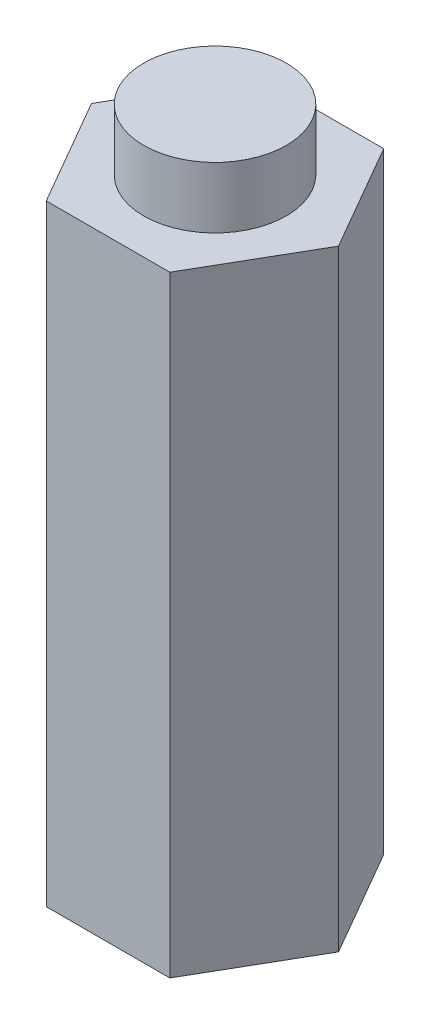
ISO-10303-21;
HEADER;
FILE_DESCRIPTION(('STEP AP214'),'2;1');
FILE_NAME('part.step','',(''),(''),'','','');
FILE_SCHEMA(('AUTOMOTIVE_DESIGN { 1 0 10303 214 1 1 1 1 }'));
ENDSEC;
DATA;
#1=APPLICATION_CONTEXT('core data for automotive mechanical design processes');
#2=APPLICATION_PROTOCOL_DEFINITION('international standard','automotive_design',2000,#1);
#3=PRODUCT_CONTEXT('',#1,'mechanical');
#4=PRODUCT('Part','Part','',(#3));
#5=PRODUCT_RELATED_PRODUCT_CATEGORY('part','',(#4));
#6=PRODUCT_DEFINITION_FORMATION('','',#4);
#7=PRODUCT_DEFINITION_CONTEXT('part definition',#1,'design');
#8=PRODUCT_DEFINITION('design','',#6,#7);
#9=PRODUCT_DEFINITION_SHAPE('','',#8);
#10=(LENGTH_UNIT() NAMED_UNIT(*) SI_UNIT(.MILLI.,.METRE.));
#11=(NAMED_UNIT(*) PLANE_ANGLE_UNIT() SI_UNIT($,.RADIAN.));
#12=(NAMED_UNIT(*) SI_UNIT($,.STERADIAN.) SOLID_ANGLE_UNIT());
#13=UNCERTAINTY_MEASURE_WITH_UNIT(LENGTH_MEASURE(1.E-05),#10,'distance_accuracy_value','');
#14=(GEOMETRIC_REPRESENTATION_CONTEXT(3) GLOBAL_UNCERTAINTY_ASSIGNED_CONTEXT((#13)) GLOBAL_UNIT_ASSIGNED_CONTEXT((#10,
#11,#12)) REPRESENTATION_CONTEXT('',''));
#15=CARTESIAN_POINT('',(0.,0.,0.));
#16=DIRECTION('',(0.,0.,1.));
#17=DIRECTION('',(1.,0.,0.));
#18=AXIS2_PLACEMENT_3D('',#15,#16,#17);
#19=CARTESIAN_POINT('',(-6.06217782649108,60.,-10.5));
#20=DIRECTION('',(0.866025403784439,0.,0.5));
#21=DIRECTION('',(0.5,0.,-0.866025403784439));
#22=AXIS2_PLACEMENT_3D('',#19,#20,#21);
#23=PLANE('',#22);
#24=DIRECTION('',(-0.5,0.,0.866025403784439));
#25=VECTOR('',#24,1.);
#26=CARTESIAN_POINT('',(-6.06217782649108,0.,-10.5));
#27=LINE('',#26,#25);
#28=CARTESIAN_POINT('',(-6.06217782649108,0.,-10.5));
#29=VERTEX_POINT('',#28);
#30=CARTESIAN_POINT('',(-12.1243556529821,0.,0.));
#31=VERTEX_POINT('',#30);
#32=EDGE_CURVE('E130',#29,#31,#27,.T.);
#33=ORIENTED_EDGE('',*,*,#32,.T.);
#34=DIRECTION('',(0.,-1.,0.));
#35=VECTOR('',#34,1.);
#36=CARTESIAN_POINT('',(-12.1243556529821,60.,0.));
#37=LINE('',#36,#35);
#38=CARTESIAN_POINT('',(-12.1243556529821,60.,0.));
#39=VERTEX_POINT('',#38);
#40=EDGE_CURVE('E42',#39,#31,#37,.T.);
#41=ORIENTED_EDGE('',*,*,#40,.F.);
#42=DIRECTION('',(-0.5,0.,0.866025403784439));
#43=VECTOR('',#42,1.);
#44=CARTESIAN_POINT('',(-6.06217782649108,60.,-10.5));
#45=LINE('',#44,#43);
#46=CARTESIAN_POINT('',(-6.06217782649108,60.,-10.5));
#47=VERTEX_POINT('',#46);
#48=EDGE_CURVE('E140',#47,#39,#45,.T.);
#49=ORIENTED_EDGE('',*,*,#48,.F.);
#50=DIRECTION('',(0.,-1.,0.));
#51=VECTOR('',#50,1.);
#52=CARTESIAN_POINT('',(-6.06217782649108,60.,-10.5));
#53=LINE('',#52,#51);
#54=EDGE_CURVE('E125',#47,#29,#53,.T.);
#55=ORIENTED_EDGE('',*,*,#54,.T.);
#56=EDGE_LOOP('',(#33,#41,#49,#55));
#57=FACE_BOUND('',#56,.T.);
#58=ADVANCED_FACE('F41',(#57),#23,.F.);
#59=CARTESIAN_POINT('',(-12.1243556529821,60.,0.));
#60=DIRECTION('',(0.866025403784438,0.,-0.5));
#61=DIRECTION('',(-0.5,0.,-0.866025403784439));
#62=AXIS2_PLACEMENT_3D('',#59,#60,#61);
#63=PLANE('',#62);
#64=DIRECTION('',(0.5,0.,0.866025403784438));
#65=VECTOR('',#64,1.);
#66=CARTESIAN_POINT('',(-12.1243556529821,0.,0.));
#67=LINE('',#66,#65);
#68=CARTESIAN_POINT('',(-6.06217782649107,0.,10.5));
#69=VERTEX_POINT('',#68);
#70=EDGE_CURVE('E128',#31,#69,#67,.T.);
#71=ORIENTED_EDGE('',*,*,#70,.T.);
#72=DIRECTION('',(0.,-1.,0.));
#73=VECTOR('',#72,1.);
#74=CARTESIAN_POINT('',(-6.06217782649107,60.,10.5));
#75=LINE('',#74,#73);
#76=CARTESIAN_POINT('',(-6.06217782649107,60.,10.5));
#77=VERTEX_POINT('',#76);
#78=EDGE_CURVE('E143',#77,#69,#75,.T.);
#79=ORIENTED_EDGE('',*,*,#78,.F.);
#80=DIRECTION('',(0.5,0.,0.866025403784438));
#81=VECTOR('',#80,1.);
#82=CARTESIAN_POINT('',(-12.1243556529821,60.,0.));
#83=LINE('',#82,#81);
#84=EDGE_CURVE('E96',#39,#77,#83,.T.);
#85=ORIENTED_EDGE('',*,*,#84,.F.);
#86=ORIENTED_EDGE('',*,*,#40,.T.);
#87=EDGE_LOOP('',(#71,#79,#85,#86));
#88=FACE_BOUND('',#87,.T.);
#89=ADVANCED_FACE('F148',(#88),#63,.F.);
#90=CARTESIAN_POINT('',(-6.06217782649107,60.,10.5));
#91=DIRECTION('',(0.,0.,-1.));
#92=DIRECTION('',(-1.,0.,0.));
#93=AXIS2_PLACEMENT_3D('',#90,#91,#92);
#94=PLANE('',#93);
#95=DIRECTION('',(1.,0.,0.));
#96=VECTOR('',#95,1.);
#97=CARTESIAN_POINT('',(-6.06217782649107,0.,10.5));
#98=LINE('',#97,#96);
#99=CARTESIAN_POINT('',(6.06217782649107,0.,10.5));
#100=VERTEX_POINT('',#99);
#101=EDGE_CURVE('E134',#69,#100,#98,.T.);
#102=ORIENTED_EDGE('',*,*,#101,.T.);
#103=DIRECTION('',(0.,-1.,0.));
#104=VECTOR('',#103,1.);
#105=CARTESIAN_POINT('',(6.06217782649107,60.,10.5));
#106=LINE('',#105,#104);
#107=CARTESIAN_POINT('',(6.06217782649107,60.,10.5));
#108=VERTEX_POINT('',#107);
#109=EDGE_CURVE('E119',#108,#100,#106,.T.);
#110=ORIENTED_EDGE('',*,*,#109,.F.);
#111=DIRECTION('',(1.,0.,0.));
#112=VECTOR('',#111,1.);
#113=CARTESIAN_POINT('',(-6.06217782649107,60.,10.5));
#114=LINE('',#113,#112);
#115=EDGE_CURVE('E108',#77,#108,#114,.T.);
#116=ORIENTED_EDGE('',*,*,#115,.F.);
#117=ORIENTED_EDGE('',*,*,#78,.T.);
#118=EDGE_LOOP('',(#102,#110,#116,#117));
#119=FACE_BOUND('',#118,.T.);
#120=ADVANCED_FACE('F155',(#119),#94,.F.);
#121=CARTESIAN_POINT('',(6.06217782649107,60.,10.5));
#122=DIRECTION('',(-0.866025403784438,0.,-0.5));
#123=DIRECTION('',(-0.5,0.,0.866025403784439));
#124=AXIS2_PLACEMENT_3D('',#121,#122,#123);
#125=PLANE('',#124);
#126=DIRECTION('',(0.5,0.,-0.866025403784438));
#127=VECTOR('',#126,1.);
#128=CARTESIAN_POINT('',(6.06217782649107,0.,10.5));
#129=LINE('',#128,#127);
#130=CARTESIAN_POINT('',(12.1243556529821,0.,0.));
#131=VERTEX_POINT('',#130);
#132=EDGE_CURVE('E120',#100,#131,#129,.T.);
#133=ORIENTED_EDGE('',*,*,#132,.T.);
#134=DIRECTION('',(0.,-1.,0.));
#135=VECTOR('',#134,1.);
#136=CARTESIAN_POINT('',(12.1243556529821,60.,0.));
#137=LINE('',#136,#135);
#138=CARTESIAN_POINT('',(12.1243556529821,60.,0.));
#139=VERTEX_POINT('',#138);
#140=EDGE_CURVE('E111',#139,#131,#137,.T.);
#141=ORIENTED_EDGE('',*,*,#140,.F.);
#142=DIRECTION('',(0.5,0.,-0.866025403784438));
#143=VECTOR('',#142,1.);
#144=CARTESIAN_POINT('',(6.06217782649107,60.,10.5));
#145=LINE('',#144,#143);
#146=EDGE_CURVE('E103',#108,#139,#145,.T.);
#147=ORIENTED_EDGE('',*,*,#146,.F.);
#148=ORIENTED_EDGE('',*,*,#109,.T.);
#149=EDGE_LOOP('',(#133,#141,#147,#148));
#150=FACE_BOUND('',#149,.T.);
#151=ADVANCED_FACE('F113',(#150),#125,.F.);
#152=CARTESIAN_POINT('',(12.1243556529821,60.,0.));
#153=DIRECTION('',(-0.866025403784439,0.,0.5));
#154=DIRECTION('',(0.5,0.,0.866025403784439));
#155=AXIS2_PLACEMENT_3D('',#152,#153,#154);
#156=PLANE('',#155);
#157=DIRECTION('',(-0.5,0.,-0.866025403784439));
#158=VECTOR('',#157,1.);
#159=CARTESIAN_POINT('',(12.1243556529821,0.,0.));
#160=LINE('',#159,#158);
#161=CARTESIAN_POINT('',(6.06217782649107,0.,-10.5));
#162=VERTEX_POINT('',#161);
#163=EDGE_CURVE('E84',#131,#162,#160,.T.);
#164=ORIENTED_EDGE('',*,*,#163,.T.);
#165=DIRECTION('',(0.,-1.,0.));
#166=VECTOR('',#165,1.);
#167=CARTESIAN_POINT('',(6.06217782649107,60.,-10.5));
#168=LINE('',#167,#166);
#169=CARTESIAN_POINT('',(6.06217782649107,60.,-10.5));
#170=VERTEX_POINT('',#169);
#171=EDGE_CURVE('E116',#170,#162,#168,.T.);
#172=ORIENTED_EDGE('',*,*,#171,.F.);
#173=DIRECTION('',(-0.5,0.,-0.866025403784439));
#174=VECTOR('',#173,1.);
#175=CARTESIAN_POINT('',(12.1243556529821,60.,0.));
#176=LINE('',#175,#174);
#177=EDGE_CURVE('E110',#139,#170,#176,.T.);
#178=ORIENTED_EDGE('',*,*,#177,.F.);
#179=ORIENTED_EDGE('',*,*,#140,.T.);
#180=EDGE_LOOP('',(#164,#172,#178,#179));
#181=FACE_BOUND('',#180,.T.);
#182=ADVANCED_FACE('F124',(#181),#156,.F.);
#183=CARTESIAN_POINT('',(6.06217782649107,60.,-10.5));
#184=DIRECTION('',(0.,0.,1.));
#185=DIRECTION('',(1.,0.,0.));
#186=AXIS2_PLACEMENT_3D('',#183,#184,#185);
#187=PLANE('',#186);
#188=DIRECTION('',(-1.,0.,0.));
#189=VECTOR('',#188,1.);
#190=CARTESIAN_POINT('',(6.06217782649107,0.,-10.5));
#191=LINE('',#190,#189);
#192=EDGE_CURVE('E87',#162,#29,#191,.T.);
#193=ORIENTED_EDGE('',*,*,#192,.T.);
#194=ORIENTED_EDGE('',*,*,#54,.F.);
#195=DIRECTION('',(-1.,0.,0.));
#196=VECTOR('',#195,1.);
#197=CARTESIAN_POINT('',(6.06217782649107,60.,-10.5));
#198=LINE('',#197,#196);
#199=EDGE_CURVE('E59',#170,#47,#198,.T.);
#200=ORIENTED_EDGE('',*,*,#199,.F.);
#201=ORIENTED_EDGE('',*,*,#171,.T.);
#202=EDGE_LOOP('',(#193,#194,#200,#201));
#203=FACE_BOUND('',#202,.T.);
#204=ADVANCED_FACE('F169',(#203),#187,.F.);
#205=CARTESIAN_POINT('',(0.,60.,0.));
#206=DIRECTION('',(0.,1.,0.));
#207=DIRECTION('',(0.,0.,1.));
#208=AXIS2_PLACEMENT_3D('',#205,#206,#207);
#209=PLANE('',#208);
#210=CARTESIAN_POINT('',(0.,60.,0.));
#211=DIRECTION('',(0.,1.,0.));
#212=DIRECTION('',(0.,0.,1.));
#213=AXIS2_PLACEMENT_3D('',#210,#211,#212);
#214=CIRCLE('',#213,7.);
#215=CARTESIAN_POINT('',(0.,60.,7.));
#216=VERTEX_POINT('',#215);
#217=EDGE_CURVE('E11',#216,#216,#214,.T.);
#218=ORIENTED_EDGE('',*,*,#217,.F.);
#219=EDGE_LOOP('',(#218));
#220=FACE_BOUND('',#219,.T.);
#221=ORIENTED_EDGE('',*,*,#48,.T.);
#222=ORIENTED_EDGE('',*,*,#84,.T.);
#223=ORIENTED_EDGE('',*,*,#115,.T.);
#224=ORIENTED_EDGE('',*,*,#146,.T.);
#225=ORIENTED_EDGE('',*,*,#177,.T.);
#226=ORIENTED_EDGE('',*,*,#199,.T.);
#227=EDGE_LOOP('',(#221,#222,#223,#224,#225,#226));
#228=FACE_BOUND('',#227,.T.);
#229=ADVANCED_FACE('F104',(#220,#228),#209,.T.);
#230=CARTESIAN_POINT('',(0.,0.,0.));
#231=DIRECTION('',(0.,1.,0.));
#232=DIRECTION('',(0.,0.,1.));
#233=AXIS2_PLACEMENT_3D('',#230,#231,#232);
#234=PLANE('',#233);
#235=ORIENTED_EDGE('',*,*,#32,.F.);
#236=ORIENTED_EDGE('',*,*,#192,.F.);
#237=ORIENTED_EDGE('',*,*,#163,.F.);
#238=ORIENTED_EDGE('',*,*,#132,.F.);
#239=ORIENTED_EDGE('',*,*,#101,.F.);
#240=ORIENTED_EDGE('',*,*,#70,.F.);
#241=EDGE_LOOP('',(#235,#236,#237,#238,#239,#240));
#242=FACE_BOUND('',#241,.T.);
#243=ADVANCED_FACE('F151',(#242),#234,.F.);
#244=CARTESIAN_POINT('',(0.,66.,0.));
#245=DIRECTION('',(0.,-1.,0.));
#246=DIRECTION('',(0.,0.,-1.));
#247=AXIS2_PLACEMENT_3D('',#244,#245,#246);
#248=CYLINDRICAL_SURFACE('',#247,7.);
#249=CARTESIAN_POINT('',(0.,66.,0.));
#250=DIRECTION('',(0.,1.,0.));
#251=DIRECTION('',(0.,0.,1.));
#252=AXIS2_PLACEMENT_3D('',#249,#250,#251);
#253=CIRCLE('',#252,7.);
#254=CARTESIAN_POINT('',(0.,66.,7.));
#255=VERTEX_POINT('',#254);
#256=EDGE_CURVE('E132',#255,#255,#253,.T.);
#257=ORIENTED_EDGE('',*,*,#256,.F.);
#258=EDGE_LOOP('',(#257));
#259=FACE_BOUND('',#258,.T.);
#260=ORIENTED_EDGE('',*,*,#217,.T.);
#261=EDGE_LOOP('',(#260));
#262=FACE_BOUND('',#261,.T.);
#263=ADVANCED_FACE('F161',(#259,#262),#248,.T.);
#264=CARTESIAN_POINT('',(0.,66.,0.));
#265=DIRECTION('',(0.,1.,0.));
#266=DIRECTION('',(0.,0.,1.));
#267=AXIS2_PLACEMENT_3D('',#264,#265,#266);
#268=PLANE('',#267);
#269=ORIENTED_EDGE('',*,*,#256,.T.);
#270=EDGE_LOOP('',(#269));
#271=FACE_BOUND('',#270,.T.);
#272=ADVANCED_FACE('F157',(#271),#268,.T.);
#273=CLOSED_SHELL('',(#58,#89,#120,#151,#182,#204,#229,#243,#263,#272));
#274=MANIFOLD_SOLID_BREP('B2',#273);
#275=ADVANCED_BREP_SHAPE_REPRESENTATION('',(#18,#274),#14);
#276=SHAPE_DEFINITION_REPRESENTATION(#9,#275);
ENDSEC;
END-ISO-10303-21;
